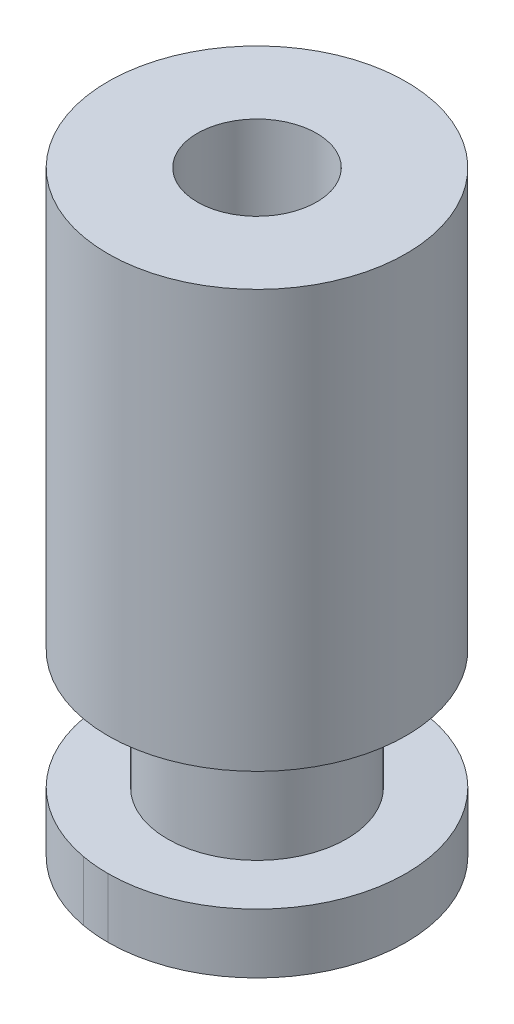
ISO-10303-21;
HEADER;
FILE_DESCRIPTION(('STEP AP214'),'2;1');
FILE_NAME('part.step','',(''),(''),'','','');
FILE_SCHEMA(('AUTOMOTIVE_DESIGN { 1 0 10303 214 1 1 1 1 }'));
ENDSEC;
DATA;
#1=APPLICATION_CONTEXT('core data for automotive mechanical design processes');
#2=APPLICATION_PROTOCOL_DEFINITION('international standard','automotive_design',2000,#1);
#3=PRODUCT_CONTEXT('',#1,'mechanical');
#4=PRODUCT('Part','Part','',(#3));
#5=PRODUCT_RELATED_PRODUCT_CATEGORY('part','',(#4));
#6=PRODUCT_DEFINITION_FORMATION('','',#4);
#7=PRODUCT_DEFINITION_CONTEXT('part definition',#1,'design');
#8=PRODUCT_DEFINITION('design','',#6,#7);
#9=PRODUCT_DEFINITION_SHAPE('','',#8);
#10=(LENGTH_UNIT() NAMED_UNIT(*) SI_UNIT(.MILLI.,.METRE.));
#11=(NAMED_UNIT(*) PLANE_ANGLE_UNIT() SI_UNIT($,.RADIAN.));
#12=(NAMED_UNIT(*) SI_UNIT($,.STERADIAN.) SOLID_ANGLE_UNIT());
#13=UNCERTAINTY_MEASURE_WITH_UNIT(LENGTH_MEASURE(1.E-05),#10,'distance_accuracy_value','');
#14=(GEOMETRIC_REPRESENTATION_CONTEXT(3) GLOBAL_UNCERTAINTY_ASSIGNED_CONTEXT((#13)) GLOBAL_UNIT_ASSIGNED_CONTEXT((#10,
#11,#12)) REPRESENTATION_CONTEXT('',''));
#15=CARTESIAN_POINT('',(0.,0.,0.));
#16=DIRECTION('',(0.,0.,1.));
#17=DIRECTION('',(1.,0.,0.));
#18=AXIS2_PLACEMENT_3D('',#15,#16,#17);
#19=CARTESIAN_POINT('',(0.,50.,0.));
#20=DIRECTION('',(0.,-1.,0.));
#21=DIRECTION('',(0.,0.,-1.));
#22=AXIS2_PLACEMENT_3D('',#19,#20,#21);
#23=CYLINDRICAL_SURFACE('',#22,12.5);
#24=DIRECTION('',(0.,-1.,0.));
#25=VECTOR('',#24,1.);
#26=CARTESIAN_POINT('',(0.,50.,-12.5));
#27=LINE('',#26,#25);
#28=CARTESIAN_POINT('',(0.,5.,-12.5));
#29=VERTEX_POINT('',#28);
#30=CARTESIAN_POINT('',(0.,0.,-12.5));
#31=VERTEX_POINT('',#30);
#32=EDGE_CURVE('E11',#29,#31,#27,.T.);
#33=ORIENTED_EDGE('',*,*,#32,.F.);
#34=CARTESIAN_POINT('',(0.,5.,0.));
#35=DIRECTION('',(0.,1.,0.));
#36=DIRECTION('',(0.,0.,1.));
#37=AXIS2_PLACEMENT_3D('',#34,#35,#36);
#38=CIRCLE('',#37,12.5);
#39=CARTESIAN_POINT('',(0.,5.,12.5));
#40=VERTEX_POINT('',#39);
#41=EDGE_CURVE('E88',#40,#29,#38,.T.);
#42=ORIENTED_EDGE('',*,*,#41,.F.);
#43=DIRECTION('',(0.,-1.,0.));
#44=VECTOR('',#43,1.);
#45=CARTESIAN_POINT('',(0.,50.,12.5));
#46=LINE('',#45,#44);
#47=CARTESIAN_POINT('',(0.,0.,12.5));
#48=VERTEX_POINT('',#47);
#49=EDGE_CURVE('E51',#48,#40,#46,.F.);
#50=ORIENTED_EDGE('',*,*,#49,.F.);
#51=CARTESIAN_POINT('',(0.,0.,0.));
#52=DIRECTION('',(0.,1.,0.));
#53=DIRECTION('',(0.,0.,1.));
#54=AXIS2_PLACEMENT_3D('',#51,#52,#53);
#55=CIRCLE('',#54,12.5);
#56=EDGE_CURVE('E86',#48,#31,#55,.T.);
#57=ORIENTED_EDGE('',*,*,#56,.T.);
#58=EDGE_LOOP('',(#33,#42,#50,#57));
#59=FACE_BOUND('',#58,.T.);
#60=ADVANCED_FACE('F42',(#59),#23,.T.);
#61=CARTESIAN_POINT('',(-2.27171924083526,5.,-12.2918384178616));
#62=VERTEX_POINT('',#61);
#63=EDGE_CURVE('E147',#29,#62,#38,.T.);
#64=ORIENTED_EDGE('',*,*,#63,.F.);
#65=ORIENTED_EDGE('',*,*,#32,.T.);
#66=CARTESIAN_POINT('',(-2.27171924083526,0.,-12.2918384178616));
#67=VERTEX_POINT('',#66);
#68=EDGE_CURVE('E103',#31,#67,#55,.T.);
#69=ORIENTED_EDGE('',*,*,#68,.T.);
#70=DIRECTION('',(0.,-1.,0.));
#71=VECTOR('',#70,1.);
#72=CARTESIAN_POINT('',(-2.27171924083526,50.,-12.2918384178616));
#73=LINE('',#72,#71);
#74=EDGE_CURVE('E66',#67,#62,#73,.F.);
#75=ORIENTED_EDGE('',*,*,#74,.T.);
#76=EDGE_LOOP('',(#64,#65,#69,#75));
#77=FACE_BOUND('',#76,.T.);
#78=ADVANCED_FACE('F160',(#77),#23,.T.);
#79=DIRECTION('',(0.,-1.,0.));
#80=VECTOR('',#79,1.);
#81=CARTESIAN_POINT('',(-2.27171924083526,50.,12.2918384178616));
#82=LINE('',#81,#80);
#83=CARTESIAN_POINT('',(-2.27171924083526,5.,12.2918384178616));
#84=VERTEX_POINT('',#83);
#85=CARTESIAN_POINT('',(-2.27171924083526,0.,12.2918384178616));
#86=VERTEX_POINT('',#85);
#87=EDGE_CURVE('E58',#84,#86,#82,.T.);
#88=ORIENTED_EDGE('',*,*,#87,.F.);
#89=EDGE_CURVE('E152',#62,#84,#38,.T.);
#90=ORIENTED_EDGE('',*,*,#89,.F.);
#91=ORIENTED_EDGE('',*,*,#74,.F.);
#92=EDGE_CURVE('E98',#67,#86,#55,.T.);
#93=ORIENTED_EDGE('',*,*,#92,.T.);
#94=EDGE_LOOP('',(#88,#90,#91,#93));
#95=FACE_BOUND('',#94,.T.);
#96=ADVANCED_FACE('F158',(#95),#23,.T.);
#97=CARTESIAN_POINT('',(0.,50.,0.));
#98=DIRECTION('',(0.,1.,0.));
#99=DIRECTION('',(0.,0.,1.));
#100=AXIS2_PLACEMENT_3D('',#97,#98,#99);
#101=CIRCLE('',#100,12.5);
#102=CARTESIAN_POINT('',(0.,50.,12.5));
#103=VERTEX_POINT('',#102);
#104=EDGE_CURVE('E105',#103,#103,#101,.T.);
#105=ORIENTED_EDGE('',*,*,#104,.F.);
#106=EDGE_LOOP('',(#105));
#107=FACE_BOUND('',#106,.T.);
#108=CARTESIAN_POINT('',(0.,15.,0.));
#109=DIRECTION('',(0.,1.,0.));
#110=DIRECTION('',(0.,0.,1.));
#111=AXIS2_PLACEMENT_3D('',#108,#109,#110);
#112=CIRCLE('',#111,12.5);
#113=CARTESIAN_POINT('',(0.,15.,12.5));
#114=VERTEX_POINT('',#113);
#115=EDGE_CURVE('E131',#114,#114,#112,.T.);
#116=ORIENTED_EDGE('',*,*,#115,.T.);
#117=EDGE_LOOP('',(#116));
#118=FACE_BOUND('',#117,.T.);
#119=ADVANCED_FACE('F44',(#107,#118),#23,.T.);
#120=CARTESIAN_POINT('',(0.,50.,0.));
#121=DIRECTION('',(0.,1.,0.));
#122=DIRECTION('',(0.,0.,1.));
#123=AXIS2_PLACEMENT_3D('',#120,#121,#122);
#124=PLANE('',#123);
#125=CARTESIAN_POINT('',(0.,50.,0.));
#126=DIRECTION('',(0.,1.,0.));
#127=DIRECTION('',(0.,0.,1.));
#128=AXIS2_PLACEMENT_3D('',#125,#126,#127);
#129=CIRCLE('',#128,5.);
#130=CARTESIAN_POINT('',(0.,50.,5.));
#131=VERTEX_POINT('',#130);
#132=EDGE_CURVE('E127',#131,#131,#129,.T.);
#133=ORIENTED_EDGE('',*,*,#132,.F.);
#134=EDGE_LOOP('',(#133));
#135=FACE_BOUND('',#134,.T.);
#136=ORIENTED_EDGE('',*,*,#104,.T.);
#137=EDGE_LOOP('',(#136));
#138=FACE_BOUND('',#137,.T.);
#139=ADVANCED_FACE('F169',(#135,#138),#124,.T.);
#140=CARTESIAN_POINT('',(0.,30.,0.));
#141=DIRECTION('',(0.,1.,0.));
#142=DIRECTION('',(0.,0.,1.));
#143=AXIS2_PLACEMENT_3D('',#140,#141,#142);
#144=CYLINDRICAL_SURFACE('',#143,5.);
#145=CARTESIAN_POINT('',(0.,30.,0.));
#146=DIRECTION('',(0.,1.,0.));
#147=DIRECTION('',(0.,0.,1.));
#148=AXIS2_PLACEMENT_3D('',#145,#146,#147);
#149=CIRCLE('',#148,5.);
#150=CARTESIAN_POINT('',(0.,30.,5.));
#151=VERTEX_POINT('',#150);
#152=EDGE_CURVE('E99',#151,#151,#149,.T.);
#153=ORIENTED_EDGE('',*,*,#152,.F.);
#154=EDGE_LOOP('',(#153));
#155=FACE_BOUND('',#154,.T.);
#156=ORIENTED_EDGE('',*,*,#132,.T.);
#157=EDGE_LOOP('',(#156));
#158=FACE_BOUND('',#157,.T.);
#159=ADVANCED_FACE('F174',(#155,#158),#144,.F.);
#160=CARTESIAN_POINT('',(0.,30.,0.));
#161=DIRECTION('',(0.,1.,0.));
#162=DIRECTION('',(0.,0.,1.));
#163=AXIS2_PLACEMENT_3D('',#160,#161,#162);
#164=PLANE('',#163);
#165=ORIENTED_EDGE('',*,*,#152,.T.);
#166=EDGE_LOOP('',(#165));
#167=FACE_BOUND('',#166,.T.);
#168=ADVANCED_FACE('F191',(#167),#164,.T.);
#169=CARTESIAN_POINT('',(0.,15.,-12.5));
#170=DIRECTION('',(0.,-1.,0.));
#171=DIRECTION('',(0.,0.,-1.));
#172=AXIS2_PLACEMENT_3D('',#169,#170,#171);
#173=PLANE('',#172);
#174=CARTESIAN_POINT('',(0.,15.,0.));
#175=DIRECTION('',(0.,1.,0.));
#176=DIRECTION('',(0.,0.,1.));
#177=AXIS2_PLACEMENT_3D('',#174,#175,#176);
#178=CIRCLE('',#177,7.5);
#179=CARTESIAN_POINT('',(0.,15.,7.5));
#180=VERTEX_POINT('',#179);
#181=EDGE_CURVE('E138',#180,#180,#178,.T.);
#182=ORIENTED_EDGE('',*,*,#181,.T.);
#183=EDGE_LOOP('',(#182));
#184=FACE_BOUND('',#183,.T.);
#185=ORIENTED_EDGE('',*,*,#115,.F.);
#186=EDGE_LOOP('',(#185));
#187=FACE_BOUND('',#186,.T.);
#188=ADVANCED_FACE('F195',(#184,#187),#173,.T.);
#189=CARTESIAN_POINT('',(0.,58.266357572256,0.));
#190=DIRECTION('',(0.,1.,0.));
#191=DIRECTION('',(0.,0.,1.));
#192=AXIS2_PLACEMENT_3D('',#189,#190,#191);
#193=CYLINDRICAL_SURFACE('',#192,7.50000000000001);
#194=CARTESIAN_POINT('',(0.,5.,0.));
#195=DIRECTION('',(0.,1.,0.));
#196=DIRECTION('',(0.,0.,1.));
#197=AXIS2_PLACEMENT_3D('',#194,#195,#196);
#198=CIRCLE('',#197,7.50000000000001);
#199=CARTESIAN_POINT('',(0.,5.,7.50000000000001));
#200=VERTEX_POINT('',#199);
#201=EDGE_CURVE('E142',#200,#200,#198,.T.);
#202=ORIENTED_EDGE('',*,*,#201,.T.);
#203=EDGE_LOOP('',(#202));
#204=FACE_BOUND('',#203,.T.);
#205=ORIENTED_EDGE('',*,*,#181,.F.);
#206=EDGE_LOOP('',(#205));
#207=FACE_BOUND('',#206,.T.);
#208=ADVANCED_FACE('F186',(#204,#207),#193,.T.);
#209=CARTESIAN_POINT('',(0.,5.,-7.50000000000001));
#210=DIRECTION('',(0.,1.,0.));
#211=DIRECTION('',(0.,0.,1.));
#212=AXIS2_PLACEMENT_3D('',#209,#210,#211);
#213=PLANE('',#212);
#214=ORIENTED_EDGE('',*,*,#41,.T.);
#215=ORIENTED_EDGE('',*,*,#63,.T.);
#216=ORIENTED_EDGE('',*,*,#89,.T.);
#217=EDGE_CURVE('E148',#84,#40,#38,.T.);
#218=ORIENTED_EDGE('',*,*,#217,.T.);
#219=EDGE_LOOP('',(#214,#215,#216,#218));
#220=FACE_BOUND('',#219,.T.);
#221=ORIENTED_EDGE('',*,*,#201,.F.);
#222=EDGE_LOOP('',(#221));
#223=FACE_BOUND('',#222,.T.);
#224=ADVANCED_FACE('F156',(#220,#223),#213,.T.);
#225=CARTESIAN_POINT('',(0.,0.,0.));
#226=DIRECTION('',(0.,1.,0.));
#227=DIRECTION('',(0.,0.,1.));
#228=AXIS2_PLACEMENT_3D('',#225,#226,#227);
#229=PLANE('',#228);
#230=ORIENTED_EDGE('',*,*,#56,.F.);
#231=EDGE_CURVE('E93',#86,#48,#55,.T.);
#232=ORIENTED_EDGE('',*,*,#231,.F.);
#233=ORIENTED_EDGE('',*,*,#92,.F.);
#234=ORIENTED_EDGE('',*,*,#68,.F.);
#235=EDGE_LOOP('',(#230,#232,#233,#234));
#236=FACE_BOUND('',#235,.T.);
#237=ADVANCED_FACE('F102',(#236),#229,.F.);
#238=ORIENTED_EDGE('',*,*,#231,.T.);
#239=ORIENTED_EDGE('',*,*,#49,.T.);
#240=ORIENTED_EDGE('',*,*,#217,.F.);
#241=ORIENTED_EDGE('',*,*,#87,.T.);
#242=EDGE_LOOP('',(#238,#239,#240,#241));
#243=FACE_BOUND('',#242,.T.);
#244=ADVANCED_FACE('F94',(#243),#23,.T.);
#245=CLOSED_SHELL('',(#60,#78,#96,#119,#139,#159,#168,#188,#208,#224,#237,#244));
#246=MANIFOLD_SOLID_BREP('B2',#245);
#247=ADVANCED_BREP_SHAPE_REPRESENTATION('',(#18,#246),#14);
#248=SHAPE_DEFINITION_REPRESENTATION(#9,#247);
ENDSEC;
END-ISO-10303-21;
